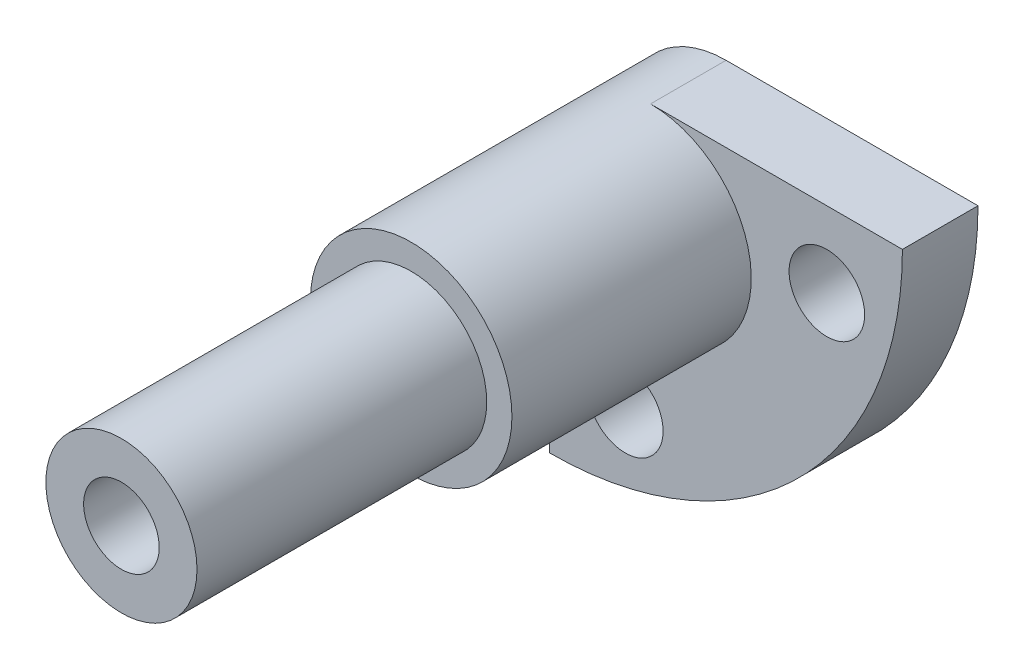
ISO-10303-21;
HEADER;
FILE_DESCRIPTION(('STEP AP214'),'2;1');
FILE_NAME('part.step','',(''),(''),'','','');
FILE_SCHEMA(('AUTOMOTIVE_DESIGN { 1 0 10303 214 1 1 1 1 }'));
ENDSEC;
DATA;
#1=APPLICATION_CONTEXT('core data for automotive mechanical design processes');
#2=APPLICATION_PROTOCOL_DEFINITION('international standard','automotive_design',2000,#1);
#3=PRODUCT_CONTEXT('',#1,'mechanical');
#4=PRODUCT('Part','Part','',(#3));
#5=PRODUCT_RELATED_PRODUCT_CATEGORY('part','',(#4));
#6=PRODUCT_DEFINITION_FORMATION('','',#4);
#7=PRODUCT_DEFINITION_CONTEXT('part definition',#1,'design');
#8=PRODUCT_DEFINITION('design','',#6,#7);
#9=PRODUCT_DEFINITION_SHAPE('','',#8);
#10=(LENGTH_UNIT() NAMED_UNIT(*) SI_UNIT(.MILLI.,.METRE.));
#11=(NAMED_UNIT(*) PLANE_ANGLE_UNIT() SI_UNIT($,.RADIAN.));
#12=(NAMED_UNIT(*) SI_UNIT($,.STERADIAN.) SOLID_ANGLE_UNIT());
#13=UNCERTAINTY_MEASURE_WITH_UNIT(LENGTH_MEASURE(1.E-05),#10,'distance_accuracy_value','');
#14=(GEOMETRIC_REPRESENTATION_CONTEXT(3) GLOBAL_UNCERTAINTY_ASSIGNED_CONTEXT((#13)) GLOBAL_UNIT_ASSIGNED_CONTEXT((#10,
#11,#12)) REPRESENTATION_CONTEXT('',''));
#15=CARTESIAN_POINT('',(0.,0.,0.));
#16=DIRECTION('',(0.,0.,1.));
#17=DIRECTION('',(1.,0.,0.));
#18=AXIS2_PLACEMENT_3D('',#15,#16,#17);
#19=CARTESIAN_POINT('',(0.,0.,12.5));
#20=DIRECTION('',(0.,0.,1.));
#21=DIRECTION('',(1.,0.,0.));
#22=AXIS2_PLACEMENT_3D('',#19,#20,#21);
#23=PLANE('',#22);
#24=CARTESIAN_POINT('',(0.,0.,12.5));
#25=DIRECTION('',(0.,0.,1.));
#26=DIRECTION('',(1.,0.,0.));
#27=AXIS2_PLACEMENT_3D('',#24,#25,#26);
#28=CIRCLE('',#27,4.);
#29=CARTESIAN_POINT('',(4.,0.,12.5));
#30=VERTEX_POINT('',#29);
#31=EDGE_CURVE('E114',#30,#30,#28,.T.);
#32=ORIENTED_EDGE('',*,*,#31,.T.);
#33=EDGE_LOOP('',(#32));
#34=FACE_BOUND('',#33,.T.);
#35=CARTESIAN_POINT('',(0.,0.,12.5));
#36=DIRECTION('',(0.,0.,1.));
#37=DIRECTION('',(1.,0.,0.));
#38=AXIS2_PLACEMENT_3D('',#35,#36,#37);
#39=CIRCLE('',#38,3.);
#40=CARTESIAN_POINT('',(3.,0.,12.5));
#41=VERTEX_POINT('',#40);
#42=EDGE_CURVE('E119',#41,#41,#39,.T.);
#43=ORIENTED_EDGE('',*,*,#42,.F.);
#44=EDGE_LOOP('',(#43));
#45=FACE_BOUND('',#44,.T.);
#46=ADVANCED_FACE('F32',(#34,#45),#23,.T.);
#47=CARTESIAN_POINT('',(0.,0.,3.));
#48=DIRECTION('',(0.,0.,-1.));
#49=DIRECTION('',(-1.,0.,0.));
#50=AXIS2_PLACEMENT_3D('',#47,#48,#49);
#51=CYLINDRICAL_SURFACE('',#50,4.);
#52=CARTESIAN_POINT('',(0.,0.,0.));
#53=DIRECTION('',(0.,0.,1.));
#54=DIRECTION('',(1.,0.,0.));
#55=AXIS2_PLACEMENT_3D('',#52,#53,#54);
#56=CIRCLE('',#55,4.);
#57=CARTESIAN_POINT('',(0.,4.,0.));
#58=VERTEX_POINT('',#57);
#59=CARTESIAN_POINT('',(-4.,0.,0.));
#60=VERTEX_POINT('',#59);
#61=EDGE_CURVE('E93',#58,#60,#56,.T.);
#62=ORIENTED_EDGE('',*,*,#61,.T.);
#63=DIRECTION('',(0.,0.,-1.));
#64=VECTOR('',#63,1.);
#65=CARTESIAN_POINT('',(-4.,0.,3.));
#66=LINE('',#65,#64);
#67=CARTESIAN_POINT('',(-4.,0.,3.));
#68=VERTEX_POINT('',#67);
#69=EDGE_CURVE('E42',#68,#60,#66,.T.);
#70=ORIENTED_EDGE('',*,*,#69,.F.);
#71=CARTESIAN_POINT('',(0.,0.,3.));
#72=DIRECTION('',(0.,0.,1.));
#73=DIRECTION('',(1.,0.,0.));
#74=AXIS2_PLACEMENT_3D('',#71,#72,#73);
#75=CIRCLE('',#74,4.);
#76=CARTESIAN_POINT('',(0.,4.,3.));
#77=VERTEX_POINT('',#76);
#78=EDGE_CURVE('E11',#68,#77,#75,.T.);
#79=ORIENTED_EDGE('',*,*,#78,.T.);
#80=DIRECTION('',(0.,0.,-1.));
#81=VECTOR('',#80,1.);
#82=CARTESIAN_POINT('',(0.,4.,3.));
#83=LINE('',#82,#81);
#84=EDGE_CURVE('E80',#77,#58,#83,.T.);
#85=ORIENTED_EDGE('',*,*,#84,.T.);
#86=EDGE_LOOP('',(#62,#70,#79,#85));
#87=FACE_BOUND('',#86,.T.);
#88=ORIENTED_EDGE('',*,*,#31,.F.);
#89=EDGE_LOOP('',(#88));
#90=FACE_BOUND('',#89,.T.);
#91=ADVANCED_FACE('F34',(#87,#90),#51,.T.);
#92=CARTESIAN_POINT('',(-4.,0.,3.));
#93=DIRECTION('',(1.,0.,0.));
#94=DIRECTION('',(0.,0.,-1.));
#95=AXIS2_PLACEMENT_3D('',#92,#93,#94);
#96=PLANE('',#95);
#97=DIRECTION('',(0.,-1.,0.));
#98=VECTOR('',#97,1.);
#99=CARTESIAN_POINT('',(-4.,0.,0.));
#100=LINE('',#99,#98);
#101=CARTESIAN_POINT('',(-4.,-9.99999999999999,0.));
#102=VERTEX_POINT('',#101);
#103=EDGE_CURVE('E111',#60,#102,#100,.T.);
#104=ORIENTED_EDGE('',*,*,#103,.T.);
#105=DIRECTION('',(0.,0.,-1.));
#106=VECTOR('',#105,1.);
#107=CARTESIAN_POINT('',(-4.,-9.99999999999999,3.));
#108=LINE('',#107,#106);
#109=CARTESIAN_POINT('',(-4.,-9.99999999999999,3.));
#110=VERTEX_POINT('',#109);
#111=EDGE_CURVE('E95',#110,#102,#108,.T.);
#112=ORIENTED_EDGE('',*,*,#111,.F.);
#113=DIRECTION('',(0.,-1.,0.));
#114=VECTOR('',#113,1.);
#115=CARTESIAN_POINT('',(-4.,0.,3.));
#116=LINE('',#115,#114);
#117=EDGE_CURVE('E100',#68,#110,#116,.T.);
#118=ORIENTED_EDGE('',*,*,#117,.F.);
#119=ORIENTED_EDGE('',*,*,#69,.T.);
#120=EDGE_LOOP('',(#104,#112,#118,#119));
#121=FACE_BOUND('',#120,.T.);
#122=ADVANCED_FACE('F171',(#121),#96,.F.);
#123=CARTESIAN_POINT('',(-4.,4.,3.));
#124=DIRECTION('',(0.,0.,-1.));
#125=DIRECTION('',(-1.,0.,0.));
#126=AXIS2_PLACEMENT_3D('',#123,#124,#125);
#127=CYLINDRICAL_SURFACE('',#126,14.);
#128=CARTESIAN_POINT('',(-4.,4.,0.));
#129=DIRECTION('',(0.,0.,1.));
#130=DIRECTION('',(-1.,0.,0.));
#131=AXIS2_PLACEMENT_3D('',#128,#129,#130);
#132=CIRCLE('',#131,14.);
#133=CARTESIAN_POINT('',(9.99999999999999,4.,0.));
#134=VERTEX_POINT('',#133);
#135=EDGE_CURVE('E68',#102,#134,#132,.T.);
#136=ORIENTED_EDGE('',*,*,#135,.T.);
#137=DIRECTION('',(0.,0.,-1.));
#138=VECTOR('',#137,1.);
#139=CARTESIAN_POINT('',(9.99999999999999,4.,3.));
#140=LINE('',#139,#138);
#141=CARTESIAN_POINT('',(9.99999999999999,4.,3.));
#142=VERTEX_POINT('',#141);
#143=EDGE_CURVE('E86',#142,#134,#140,.T.);
#144=ORIENTED_EDGE('',*,*,#143,.F.);
#145=CARTESIAN_POINT('',(-4.,4.,3.));
#146=DIRECTION('',(0.,0.,1.));
#147=DIRECTION('',(-1.,0.,0.));
#148=AXIS2_PLACEMENT_3D('',#145,#146,#147);
#149=CIRCLE('',#148,14.);
#150=EDGE_CURVE('E51',#110,#142,#149,.T.);
#151=ORIENTED_EDGE('',*,*,#150,.F.);
#152=ORIENTED_EDGE('',*,*,#111,.T.);
#153=EDGE_LOOP('',(#136,#144,#151,#152));
#154=FACE_BOUND('',#153,.T.);
#155=ADVANCED_FACE('F182',(#154),#127,.T.);
#156=CARTESIAN_POINT('',(9.99999999999999,4.,3.));
#157=DIRECTION('',(0.,-1.,0.));
#158=DIRECTION('',(0.,0.,-1.));
#159=AXIS2_PLACEMENT_3D('',#156,#157,#158);
#160=PLANE('',#159);
#161=DIRECTION('',(-1.,0.,0.));
#162=VECTOR('',#161,1.);
#163=CARTESIAN_POINT('',(9.99999999999999,4.,0.));
#164=LINE('',#163,#162);
#165=EDGE_CURVE('E74',#134,#58,#164,.T.);
#166=ORIENTED_EDGE('',*,*,#165,.T.);
#167=ORIENTED_EDGE('',*,*,#84,.F.);
#168=DIRECTION('',(-1.,0.,0.));
#169=VECTOR('',#168,1.);
#170=CARTESIAN_POINT('',(9.99999999999999,4.,3.));
#171=LINE('',#170,#169);
#172=EDGE_CURVE('E82',#142,#77,#171,.T.);
#173=ORIENTED_EDGE('',*,*,#172,.F.);
#174=ORIENTED_EDGE('',*,*,#143,.T.);
#175=EDGE_LOOP('',(#166,#167,#173,#174));
#176=FACE_BOUND('',#175,.T.);
#177=ADVANCED_FACE('F81',(#176),#160,.F.);
#178=CARTESIAN_POINT('',(0.,0.,3.));
#179=DIRECTION('',(0.,0.,1.));
#180=DIRECTION('',(1.,0.,0.));
#181=AXIS2_PLACEMENT_3D('',#178,#179,#180);
#182=PLANE('',#181);
#183=CARTESIAN_POINT('',(-1.,-6.99999999999999,3.));
#184=DIRECTION('',(0.,0.,1.));
#185=DIRECTION('',(1.,0.,0.));
#186=AXIS2_PLACEMENT_3D('',#183,#184,#185);
#187=CIRCLE('',#186,1.5);
#188=CARTESIAN_POINT('',(0.499999999999997,-6.99999999999999,3.));
#189=VERTEX_POINT('',#188);
#190=EDGE_CURVE('E139',#189,#189,#187,.T.);
#191=ORIENTED_EDGE('',*,*,#190,.F.);
#192=EDGE_LOOP('',(#191));
#193=FACE_BOUND('',#192,.T.);
#194=CARTESIAN_POINT('',(7.,1.,3.));
#195=DIRECTION('',(0.,0.,1.));
#196=DIRECTION('',(1.,0.,0.));
#197=AXIS2_PLACEMENT_3D('',#194,#195,#196);
#198=CIRCLE('',#197,1.5);
#199=CARTESIAN_POINT('',(8.5,1.,3.));
#200=VERTEX_POINT('',#199);
#201=EDGE_CURVE('E133',#200,#200,#198,.T.);
#202=ORIENTED_EDGE('',*,*,#201,.F.);
#203=EDGE_LOOP('',(#202));
#204=FACE_BOUND('',#203,.T.);
#205=ORIENTED_EDGE('',*,*,#78,.F.);
#206=ORIENTED_EDGE('',*,*,#117,.T.);
#207=ORIENTED_EDGE('',*,*,#150,.T.);
#208=ORIENTED_EDGE('',*,*,#172,.T.);
#209=EDGE_LOOP('',(#205,#206,#207,#208));
#210=FACE_BOUND('',#209,.T.);
#211=ADVANCED_FACE('F88',(#193,#204,#210),#182,.T.);
#212=CARTESIAN_POINT('',(0.,0.,0.));
#213=DIRECTION('',(0.,0.,1.));
#214=DIRECTION('',(1.,0.,0.));
#215=AXIS2_PLACEMENT_3D('',#212,#213,#214);
#216=PLANE('',#215);
#217=CARTESIAN_POINT('',(-1.,-6.99999999999999,0.));
#218=DIRECTION('',(0.,0.,1.));
#219=DIRECTION('',(1.,0.,0.));
#220=AXIS2_PLACEMENT_3D('',#217,#218,#219);
#221=CIRCLE('',#220,1.5);
#222=CARTESIAN_POINT('',(0.499999999999997,-6.99999999999999,0.));
#223=VERTEX_POINT('',#222);
#224=EDGE_CURVE('E136',#223,#223,#221,.F.);
#225=ORIENTED_EDGE('',*,*,#224,.F.);
#226=EDGE_LOOP('',(#225));
#227=FACE_BOUND('',#226,.T.);
#228=CARTESIAN_POINT('',(7.,1.,0.));
#229=DIRECTION('',(0.,0.,1.));
#230=DIRECTION('',(1.,0.,0.));
#231=AXIS2_PLACEMENT_3D('',#228,#229,#230);
#232=CIRCLE('',#231,1.5);
#233=CARTESIAN_POINT('',(8.5,1.,0.));
#234=VERTEX_POINT('',#233);
#235=EDGE_CURVE('E130',#234,#234,#232,.F.);
#236=ORIENTED_EDGE('',*,*,#235,.F.);
#237=EDGE_LOOP('',(#236));
#238=FACE_BOUND('',#237,.T.);
#239=CARTESIAN_POINT('',(0.,0.,0.));
#240=DIRECTION('',(0.,0.,1.));
#241=DIRECTION('',(1.,0.,0.));
#242=AXIS2_PLACEMENT_3D('',#239,#240,#241);
#243=CIRCLE('',#242,1.5);
#244=CARTESIAN_POINT('',(1.5,0.,0.));
#245=VERTEX_POINT('',#244);
#246=EDGE_CURVE('E122',#245,#245,#243,.F.);
#247=ORIENTED_EDGE('',*,*,#246,.F.);
#248=EDGE_LOOP('',(#247));
#249=FACE_BOUND('',#248,.T.);
#250=ORIENTED_EDGE('',*,*,#61,.F.);
#251=ORIENTED_EDGE('',*,*,#165,.F.);
#252=ORIENTED_EDGE('',*,*,#135,.F.);
#253=ORIENTED_EDGE('',*,*,#103,.F.);
#254=EDGE_LOOP('',(#250,#251,#252,#253));
#255=FACE_BOUND('',#254,.T.);
#256=ADVANCED_FACE('F147',(#227,#238,#249,#255),#216,.F.);
#257=CARTESIAN_POINT('',(0.,0.,24.));
#258=DIRECTION('',(0.,0.,-1.));
#259=DIRECTION('',(-1.,0.,0.));
#260=AXIS2_PLACEMENT_3D('',#257,#258,#259);
#261=CYLINDRICAL_SURFACE('',#260,3.);
#262=CARTESIAN_POINT('',(0.,0.,24.));
#263=DIRECTION('',(0.,0.,1.));
#264=DIRECTION('',(1.,0.,0.));
#265=AXIS2_PLACEMENT_3D('',#262,#263,#264);
#266=CIRCLE('',#265,3.);
#267=CARTESIAN_POINT('',(3.,0.,24.));
#268=VERTEX_POINT('',#267);
#269=EDGE_CURVE('E118',#268,#268,#266,.T.);
#270=ORIENTED_EDGE('',*,*,#269,.F.);
#271=EDGE_LOOP('',(#270));
#272=FACE_BOUND('',#271,.T.);
#273=ORIENTED_EDGE('',*,*,#42,.T.);
#274=EDGE_LOOP('',(#273));
#275=FACE_BOUND('',#274,.T.);
#276=ADVANCED_FACE('F174',(#272,#275),#261,.T.);
#277=CARTESIAN_POINT('',(0.,0.,24.));
#278=DIRECTION('',(0.,0.,1.));
#279=DIRECTION('',(1.,0.,0.));
#280=AXIS2_PLACEMENT_3D('',#277,#278,#279);
#281=PLANE('',#280);
#282=CARTESIAN_POINT('',(0.,0.,24.));
#283=DIRECTION('',(0.,0.,1.));
#284=DIRECTION('',(1.,0.,0.));
#285=AXIS2_PLACEMENT_3D('',#282,#283,#284);
#286=CIRCLE('',#285,1.5);
#287=CARTESIAN_POINT('',(1.5,0.,24.));
#288=VERTEX_POINT('',#287);
#289=EDGE_CURVE('E127',#288,#288,#286,.T.);
#290=ORIENTED_EDGE('',*,*,#289,.F.);
#291=EDGE_LOOP('',(#290));
#292=FACE_BOUND('',#291,.T.);
#293=ORIENTED_EDGE('',*,*,#269,.T.);
#294=EDGE_LOOP('',(#293));
#295=FACE_BOUND('',#294,.T.);
#296=ADVANCED_FACE('F162',(#292,#295),#281,.T.);
#297=CARTESIAN_POINT('',(0.,0.,-4.24264068711928));
#298=DIRECTION('',(0.,0.,1.));
#299=DIRECTION('',(1.,0.,0.));
#300=AXIS2_PLACEMENT_3D('',#297,#298,#299);
#301=CYLINDRICAL_SURFACE('',#300,1.5);
#302=CARTESIAN_POINT('',(1.5,0.,0.));
#303=CARTESIAN_POINT('',(1.5,0.,0.249999999999999));
#304=CARTESIAN_POINT('',(1.5,0.,0.499999999999999));
#305=CARTESIAN_POINT('',(1.5,0.,0.999999999999999));
#306=CARTESIAN_POINT('',(1.5,0.,1.25));
#307=CARTESIAN_POINT('',(1.5,0.,1.75));
#308=CARTESIAN_POINT('',(1.5,0.,2.));
#309=CARTESIAN_POINT('',(1.5,0.,2.5));
#310=CARTESIAN_POINT('',(1.5,0.,2.75));
#311=CARTESIAN_POINT('',(1.5,0.,3.25));
#312=CARTESIAN_POINT('',(1.5,0.,3.5));
#313=CARTESIAN_POINT('',(1.5,0.,4.));
#314=CARTESIAN_POINT('',(1.5,0.,4.25));
#315=CARTESIAN_POINT('',(1.5,0.,4.75));
#316=CARTESIAN_POINT('',(1.5,0.,5.));
#317=CARTESIAN_POINT('',(1.5,0.,5.5));
#318=CARTESIAN_POINT('',(1.5,0.,5.75));
#319=CARTESIAN_POINT('',(1.5,0.,6.25));
#320=CARTESIAN_POINT('',(1.5,0.,6.5));
#321=CARTESIAN_POINT('',(1.5,0.,7.));
#322=CARTESIAN_POINT('',(1.5,0.,7.25));
#323=CARTESIAN_POINT('',(1.5,0.,7.75));
#324=CARTESIAN_POINT('',(1.5,0.,8.));
#325=CARTESIAN_POINT('',(1.5,0.,8.5));
#326=CARTESIAN_POINT('',(1.5,0.,8.75));
#327=CARTESIAN_POINT('',(1.5,0.,9.25));
#328=CARTESIAN_POINT('',(1.5,0.,9.5));
#329=CARTESIAN_POINT('',(1.5,0.,10.));
#330=CARTESIAN_POINT('',(1.5,0.,10.25));
#331=CARTESIAN_POINT('',(1.5,0.,10.75));
#332=CARTESIAN_POINT('',(1.5,0.,11.));
#333=CARTESIAN_POINT('',(1.5,0.,11.5));
#334=CARTESIAN_POINT('',(1.5,0.,11.75));
#335=CARTESIAN_POINT('',(1.5,0.,12.25));
#336=CARTESIAN_POINT('',(1.5,0.,12.5));
#337=CARTESIAN_POINT('',(1.5,0.,13.));
#338=CARTESIAN_POINT('',(1.5,0.,13.25));
#339=CARTESIAN_POINT('',(1.5,0.,13.75));
#340=CARTESIAN_POINT('',(1.5,0.,14.));
#341=CARTESIAN_POINT('',(1.5,0.,14.5));
#342=CARTESIAN_POINT('',(1.5,0.,14.75));
#343=CARTESIAN_POINT('',(1.5,0.,15.25));
#344=CARTESIAN_POINT('',(1.5,0.,15.5));
#345=CARTESIAN_POINT('',(1.5,0.,16.));
#346=CARTESIAN_POINT('',(1.5,0.,16.25));
#347=CARTESIAN_POINT('',(1.5,0.,16.75));
#348=CARTESIAN_POINT('',(1.5,0.,17.));
#349=CARTESIAN_POINT('',(1.5,0.,17.5));
#350=CARTESIAN_POINT('',(1.5,0.,17.75));
#351=CARTESIAN_POINT('',(1.5,0.,18.25));
#352=CARTESIAN_POINT('',(1.5,0.,18.5));
#353=CARTESIAN_POINT('',(1.5,0.,19.));
#354=CARTESIAN_POINT('',(1.5,0.,19.25));
#355=CARTESIAN_POINT('',(1.5,0.,19.75));
#356=CARTESIAN_POINT('',(1.5,0.,20.));
#357=CARTESIAN_POINT('',(1.5,0.,20.5));
#358=CARTESIAN_POINT('',(1.5,0.,20.75));
#359=CARTESIAN_POINT('',(1.5,0.,21.25));
#360=CARTESIAN_POINT('',(1.5,0.,21.5));
#361=CARTESIAN_POINT('',(1.5,0.,22.));
#362=CARTESIAN_POINT('',(1.5,0.,22.25));
#363=CARTESIAN_POINT('',(1.5,0.,22.75));
#364=CARTESIAN_POINT('',(1.5,0.,23.));
#365=CARTESIAN_POINT('',(1.5,0.,23.5));
#366=CARTESIAN_POINT('',(1.5,0.,23.75));
#367=CARTESIAN_POINT('',(1.5,0.,24.));
#368=B_SPLINE_CURVE_WITH_KNOTS('',3,(#302,#303,#304,#305,#306,#307,#308,#309,#310,#311,#312,
#313,#314,#315,#316,#317,#318,#319,#320,#321,#322,#323,#324,#325,#326,#327,#328,#329,#330,#331,
#332,#333,#334,#335,#336,#337,#338,#339,#340,#341,#342,#343,#344,#345,#346,#347,#348,#349,#350,
#351,#352,#353,#354,#355,#356,#357,#358,#359,#360,#361,#362,#363,#364,#365,#366,#367),
.UNSPECIFIED.,.F.,.F.,(4,2,2,2,2,2,2,2,2,2,2,2,2,2,2,2,2,2,2,2,2,2,2,2,2,2,2,2,2,2,2,2,4),(0.,
0.75,1.5,2.25,3.,3.75,4.5,5.25,6.,6.75,7.5,8.25,9.,9.75,10.5,11.25,12.,12.75,13.5,14.25,15.,
15.75,16.5,17.25,18.,18.75,19.5,20.25,21.,21.75,22.5,23.25,24.),.UNSPECIFIED.);
#369=EDGE_CURVE('BSEAM153',#245,#288,#368,.T.);
#370=ORIENTED_EDGE('',*,*,#246,.T.);
#371=ORIENTED_EDGE('',*,*,#289,.T.);
#372=ORIENTED_EDGE('',*,*,#369,.T.);
#373=ORIENTED_EDGE('',*,*,#369,.F.);
#374=EDGE_LOOP('',(#370,#372,#371,#373));
#375=FACE_BOUND('',#374,.T.);
#376=ADVANCED_FACE('F153',(#375),#301,.F.);
#377=CARTESIAN_POINT('',(7.,1.,-4.24264068711929));
#378=DIRECTION('',(0.,0.,1.));
#379=DIRECTION('',(1.,0.,0.));
#380=AXIS2_PLACEMENT_3D('',#377,#378,#379);
#381=CYLINDRICAL_SURFACE('',#380,1.5);
#382=ORIENTED_EDGE('',*,*,#235,.T.);
#383=EDGE_LOOP('',(#382));
#384=FACE_BOUND('',#383,.T.);
#385=ORIENTED_EDGE('',*,*,#201,.T.);
#386=EDGE_LOOP('',(#385));
#387=FACE_BOUND('',#386,.T.);
#388=ADVANCED_FACE('F151',(#384,#387),#381,.F.);
#389=CARTESIAN_POINT('',(-1.,-6.99999999999999,-4.24264068711929));
#390=DIRECTION('',(0.,0.,1.));
#391=DIRECTION('',(1.,0.,0.));
#392=AXIS2_PLACEMENT_3D('',#389,#390,#391);
#393=CYLINDRICAL_SURFACE('',#392,1.5);
#394=ORIENTED_EDGE('',*,*,#224,.T.);
#395=EDGE_LOOP('',(#394));
#396=FACE_BOUND('',#395,.T.);
#397=ORIENTED_EDGE('',*,*,#190,.T.);
#398=EDGE_LOOP('',(#397));
#399=FACE_BOUND('',#398,.T.);
#400=ADVANCED_FACE('F143',(#396,#399),#393,.F.);
#401=CLOSED_SHELL('',(#46,#91,#122,#155,#177,#211,#256,#276,#296,#376,#388,#400));
#402=MANIFOLD_SOLID_BREP('B2',#401);
#403=ADVANCED_BREP_SHAPE_REPRESENTATION('',(#18,#402),#14);
#404=SHAPE_DEFINITION_REPRESENTATION(#9,#403);
ENDSEC;
END-ISO-10303-21;
